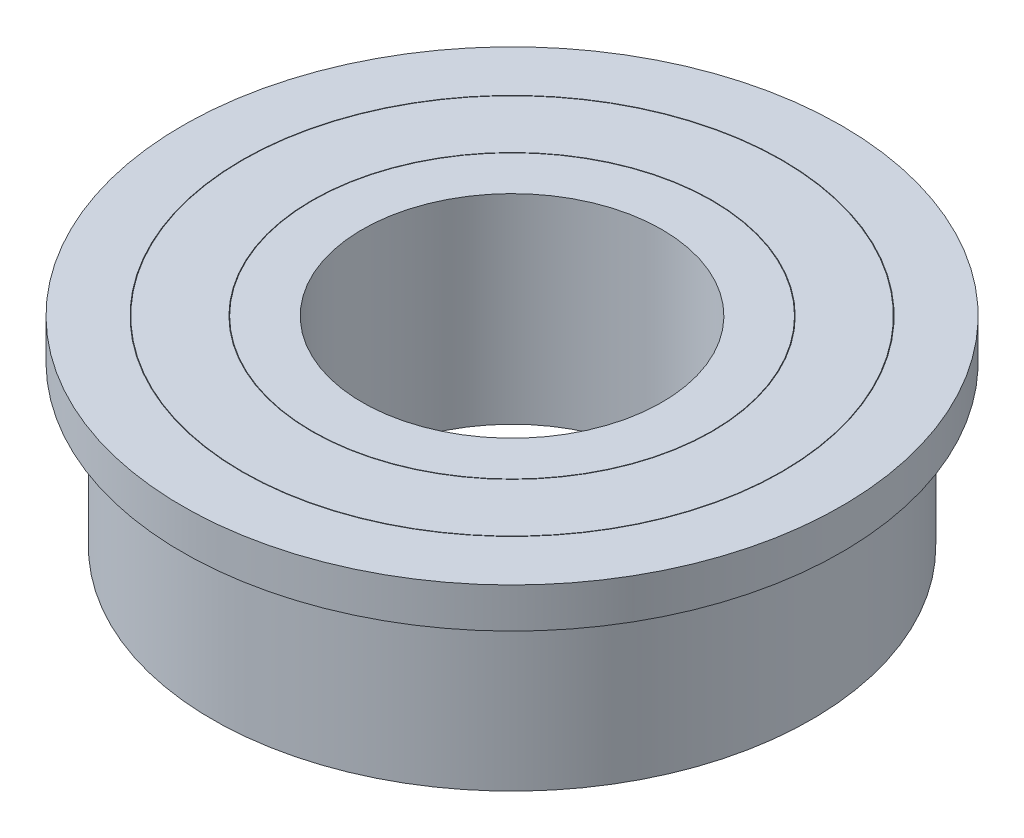
ISO-10303-21;
HEADER;
FILE_DESCRIPTION(('STEP AP214'),'2;1');
FILE_NAME('part.step','',(''),(''),'','','');
FILE_SCHEMA(('AUTOMOTIVE_DESIGN { 1 0 10303 214 1 1 1 1 }'));
ENDSEC;
DATA;
#1=APPLICATION_CONTEXT('core data for automotive mechanical design processes');
#2=APPLICATION_PROTOCOL_DEFINITION('international standard','automotive_design',2000,#1);
#3=PRODUCT_CONTEXT('',#1,'mechanical');
#4=PRODUCT('Part','Part','',(#3));
#5=PRODUCT_RELATED_PRODUCT_CATEGORY('part','',(#4));
#6=PRODUCT_DEFINITION_FORMATION('','',#4);
#7=PRODUCT_DEFINITION_CONTEXT('part definition',#1,'design');
#8=PRODUCT_DEFINITION('design','',#6,#7);
#9=PRODUCT_DEFINITION_SHAPE('','',#8);
#10=(LENGTH_UNIT() NAMED_UNIT(*) SI_UNIT(.MILLI.,.METRE.));
#11=(NAMED_UNIT(*) PLANE_ANGLE_UNIT() SI_UNIT($,.RADIAN.));
#12=(NAMED_UNIT(*) SI_UNIT($,.STERADIAN.) SOLID_ANGLE_UNIT());
#13=UNCERTAINTY_MEASURE_WITH_UNIT(LENGTH_MEASURE(1.E-05),#10,'distance_accuracy_value','');
#14=(GEOMETRIC_REPRESENTATION_CONTEXT(3) GLOBAL_UNCERTAINTY_ASSIGNED_CONTEXT((#13)) GLOBAL_UNIT_ASSIGNED_CONTEXT((#10,
#11,#12)) REPRESENTATION_CONTEXT('',''));
#15=CARTESIAN_POINT('',(0.,0.,0.));
#16=DIRECTION('',(0.,0.,1.));
#17=DIRECTION('',(1.,0.,0.));
#18=AXIS2_PLACEMENT_3D('',#15,#16,#17);
#19=CARTESIAN_POINT('',(0.,0.,4.01));
#20=DIRECTION('',(0.,1.,0.));
#21=DIRECTION('',(0.,0.,1.));
#22=AXIS2_PLACEMENT_3D('',#19,#20,#21);
#23=PLANE('',#22);
#24=CARTESIAN_POINT('',(0.,0.,0.));
#25=DIRECTION('',(0.,-1.,0.));
#26=DIRECTION('',(0.,0.,-1.));
#27=AXIS2_PLACEMENT_3D('',#24,#25,#26);
#28=CIRCLE('',#27,4.01);
#29=CARTESIAN_POINT('',(0.,0.,-4.01));
#30=VERTEX_POINT('',#29);
#31=EDGE_CURVE('E63',#30,#30,#28,.T.);
#32=ORIENTED_EDGE('',*,*,#31,.F.);
#33=EDGE_LOOP('',(#32));
#34=FACE_BOUND('',#33,.T.);
#35=CARTESIAN_POINT('',(0.,0.,0.));
#36=DIRECTION('',(0.,-1.,0.));
#37=DIRECTION('',(0.,0.,-1.));
#38=AXIS2_PLACEMENT_3D('',#35,#36,#37);
#39=CIRCLE('',#38,5.4);
#40=CARTESIAN_POINT('',(0.,0.,-5.4));
#41=VERTEX_POINT('',#40);
#42=EDGE_CURVE('E11',#41,#41,#39,.T.);
#43=ORIENTED_EDGE('',*,*,#42,.T.);
#44=EDGE_LOOP('',(#43));
#45=FACE_BOUND('',#44,.T.);
#46=ADVANCED_FACE('F46',(#34,#45),#23,.F.);
#47=CARTESIAN_POINT('',(0.,0.,0.));
#48=DIRECTION('',(0.,-1.,0.));
#49=DIRECTION('',(0.,0.,-1.));
#50=AXIS2_PLACEMENT_3D('',#47,#48,#49);
#51=CYLINDRICAL_SURFACE('',#50,5.4);
#52=ORIENTED_EDGE('',*,*,#42,.F.);
#53=EDGE_LOOP('',(#52));
#54=FACE_BOUND('',#53,.T.);
#55=CARTESIAN_POINT('',(0.,4.,0.));
#56=DIRECTION('',(0.,-1.,0.));
#57=DIRECTION('',(0.,0.,-1.));
#58=AXIS2_PLACEMENT_3D('',#55,#56,#57);
#59=CIRCLE('',#58,5.4);
#60=CARTESIAN_POINT('',(0.,4.,-5.4));
#61=VERTEX_POINT('',#60);
#62=EDGE_CURVE('E53',#61,#61,#59,.T.);
#63=ORIENTED_EDGE('',*,*,#62,.T.);
#64=EDGE_LOOP('',(#63));
#65=FACE_BOUND('',#64,.T.);
#66=ADVANCED_FACE('F73',(#54,#65),#51,.T.);
#67=CARTESIAN_POINT('',(0.,4.,5.4));
#68=DIRECTION('',(0.,-1.,0.));
#69=DIRECTION('',(0.,0.,-1.));
#70=AXIS2_PLACEMENT_3D('',#67,#68,#69);
#71=PLANE('',#70);
#72=ORIENTED_EDGE('',*,*,#62,.F.);
#73=EDGE_LOOP('',(#72));
#74=FACE_BOUND('',#73,.T.);
#75=CARTESIAN_POINT('',(0.,4.,0.));
#76=DIRECTION('',(0.,-1.,0.));
#77=DIRECTION('',(0.,0.,-1.));
#78=AXIS2_PLACEMENT_3D('',#75,#76,#77);
#79=CIRCLE('',#78,4.01);
#80=CARTESIAN_POINT('',(0.,4.,-4.01));
#81=VERTEX_POINT('',#80);
#82=EDGE_CURVE('E58',#81,#81,#79,.T.);
#83=ORIENTED_EDGE('',*,*,#82,.T.);
#84=EDGE_LOOP('',(#83));
#85=FACE_BOUND('',#84,.T.);
#86=ADVANCED_FACE('F77',(#74,#85),#71,.F.);
#87=CARTESIAN_POINT('',(0.,0.,0.));
#88=DIRECTION('',(0.,-1.,0.));
#89=DIRECTION('',(0.,0.,-1.));
#90=AXIS2_PLACEMENT_3D('',#87,#88,#89);
#91=CYLINDRICAL_SURFACE('',#90,4.01);
#92=ORIENTED_EDGE('',*,*,#82,.F.);
#93=EDGE_LOOP('',(#92));
#94=FACE_BOUND('',#93,.T.);
#95=ORIENTED_EDGE('',*,*,#31,.T.);
#96=EDGE_LOOP('',(#95));
#97=FACE_BOUND('',#96,.T.);
#98=ADVANCED_FACE('F70',(#94,#97),#91,.F.);
#99=CLOSED_SHELL('',(#46,#66,#86,#98));
#100=MANIFOLD_SOLID_BREP('B2',#99);
#101=CARTESIAN_POINT('',(0.,0.,5.41));
#102=DIRECTION('',(0.,1.,0.));
#103=DIRECTION('',(0.,0.,1.));
#104=AXIS2_PLACEMENT_3D('',#101,#102,#103);
#105=PLANE('',#104);
#106=CARTESIAN_POINT('',(0.,0.,0.));
#107=DIRECTION('',(0.,-1.,0.));
#108=DIRECTION('',(0.,0.,-1.));
#109=AXIS2_PLACEMENT_3D('',#106,#107,#108);
#110=CIRCLE('',#109,5.41);
#111=CARTESIAN_POINT('',(0.,0.,-5.41));
#112=VERTEX_POINT('',#111);
#113=EDGE_CURVE('E141',#112,#112,#110,.T.);
#114=ORIENTED_EDGE('',*,*,#113,.F.);
#115=EDGE_LOOP('',(#114));
#116=FACE_BOUND('',#115,.T.);
#117=CARTESIAN_POINT('',(0.,0.,0.));
#118=DIRECTION('',(0.,-1.,0.));
#119=DIRECTION('',(0.,0.,-1.));
#120=AXIS2_PLACEMENT_3D('',#117,#118,#119);
#121=CIRCLE('',#120,6.);
#122=CARTESIAN_POINT('',(0.,0.,-6.));
#123=VERTEX_POINT('',#122);
#124=EDGE_CURVE('E45',#123,#123,#121,.T.);
#125=ORIENTED_EDGE('',*,*,#124,.T.);
#126=EDGE_LOOP('',(#125));
#127=FACE_BOUND('',#126,.T.);
#128=ADVANCED_FACE('F119',(#116,#127),#105,.F.);
#129=CARTESIAN_POINT('',(0.,0.,0.));
#130=DIRECTION('',(0.,-1.,0.));
#131=DIRECTION('',(0.,0.,-1.));
#132=AXIS2_PLACEMENT_3D('',#129,#130,#131);
#133=CYLINDRICAL_SURFACE('',#132,6.);
#134=ORIENTED_EDGE('',*,*,#124,.F.);
#135=EDGE_LOOP('',(#134));
#136=FACE_BOUND('',#135,.T.);
#137=CARTESIAN_POINT('',(0.,3.2,0.));
#138=DIRECTION('',(0.,-1.,0.));
#139=DIRECTION('',(0.,0.,-1.));
#140=AXIS2_PLACEMENT_3D('',#137,#138,#139);
#141=CIRCLE('',#140,6.);
#142=CARTESIAN_POINT('',(0.,3.2,-6.));
#143=VERTEX_POINT('',#142);
#144=EDGE_CURVE('E125',#143,#143,#141,.T.);
#145=ORIENTED_EDGE('',*,*,#144,.T.);
#146=EDGE_LOOP('',(#145));
#147=FACE_BOUND('',#146,.T.);
#148=ADVANCED_FACE('F148',(#136,#147),#133,.T.);
#149=CARTESIAN_POINT('',(0.,3.2,6.));
#150=DIRECTION('',(0.,1.,0.));
#151=DIRECTION('',(0.,0.,1.));
#152=AXIS2_PLACEMENT_3D('',#149,#150,#151);
#153=PLANE('',#152);
#154=ORIENTED_EDGE('',*,*,#144,.F.);
#155=EDGE_LOOP('',(#154));
#156=FACE_BOUND('',#155,.T.);
#157=CARTESIAN_POINT('',(0.,3.2,0.));
#158=DIRECTION('',(0.,-1.,0.));
#159=DIRECTION('',(0.,0.,-1.));
#160=AXIS2_PLACEMENT_3D('',#157,#158,#159);
#161=CIRCLE('',#160,6.6);
#162=CARTESIAN_POINT('',(0.,3.2,-6.6));
#163=VERTEX_POINT('',#162);
#164=EDGE_CURVE('E129',#163,#163,#161,.T.);
#165=ORIENTED_EDGE('',*,*,#164,.T.);
#166=EDGE_LOOP('',(#165));
#167=FACE_BOUND('',#166,.T.);
#168=ADVANCED_FACE('F152',(#156,#167),#153,.F.);
#169=CARTESIAN_POINT('',(0.,0.,0.));
#170=DIRECTION('',(0.,-1.,0.));
#171=DIRECTION('',(0.,0.,-1.));
#172=AXIS2_PLACEMENT_3D('',#169,#170,#171);
#173=CYLINDRICAL_SURFACE('',#172,6.6);
#174=ORIENTED_EDGE('',*,*,#164,.F.);
#175=EDGE_LOOP('',(#174));
#176=FACE_BOUND('',#175,.T.);
#177=CARTESIAN_POINT('',(0.,4.,0.));
#178=DIRECTION('',(0.,-1.,0.));
#179=DIRECTION('',(0.,0.,-1.));
#180=AXIS2_PLACEMENT_3D('',#177,#178,#179);
#181=CIRCLE('',#180,6.6);
#182=CARTESIAN_POINT('',(0.,4.,-6.6));
#183=VERTEX_POINT('',#182);
#184=EDGE_CURVE('E133',#183,#183,#181,.T.);
#185=ORIENTED_EDGE('',*,*,#184,.T.);
#186=EDGE_LOOP('',(#185));
#187=FACE_BOUND('',#186,.T.);
#188=ADVANCED_FACE('F157',(#176,#187),#173,.T.);
#189=CARTESIAN_POINT('',(0.,4.,6.6));
#190=DIRECTION('',(0.,-1.,0.));
#191=DIRECTION('',(0.,0.,-1.));
#192=AXIS2_PLACEMENT_3D('',#189,#190,#191);
#193=PLANE('',#192);
#194=ORIENTED_EDGE('',*,*,#184,.F.);
#195=EDGE_LOOP('',(#194));
#196=FACE_BOUND('',#195,.T.);
#197=CARTESIAN_POINT('',(0.,4.,0.));
#198=DIRECTION('',(0.,-1.,0.));
#199=DIRECTION('',(0.,0.,-1.));
#200=AXIS2_PLACEMENT_3D('',#197,#198,#199);
#201=CIRCLE('',#200,5.41);
#202=CARTESIAN_POINT('',(0.,4.,-5.41));
#203=VERTEX_POINT('',#202);
#204=EDGE_CURVE('E138',#203,#203,#201,.T.);
#205=ORIENTED_EDGE('',*,*,#204,.T.);
#206=EDGE_LOOP('',(#205));
#207=FACE_BOUND('',#206,.T.);
#208=ADVANCED_FACE('F163',(#196,#207),#193,.F.);
#209=CARTESIAN_POINT('',(0.,0.,0.));
#210=DIRECTION('',(0.,-1.,0.));
#211=DIRECTION('',(0.,0.,-1.));
#212=AXIS2_PLACEMENT_3D('',#209,#210,#211);
#213=CYLINDRICAL_SURFACE('',#212,5.41);
#214=ORIENTED_EDGE('',*,*,#204,.F.);
#215=EDGE_LOOP('',(#214));
#216=FACE_BOUND('',#215,.T.);
#217=ORIENTED_EDGE('',*,*,#113,.T.);
#218=EDGE_LOOP('',(#217));
#219=FACE_BOUND('',#218,.T.);
#220=ADVANCED_FACE('F145',(#216,#219),#213,.F.);
#221=CLOSED_SHELL('',(#128,#148,#168,#188,#208,#220));
#222=MANIFOLD_SOLID_BREP('B6',#221);
#223=CARTESIAN_POINT('',(0.,0.,0.));
#224=DIRECTION('',(0.,-1.,0.));
#225=DIRECTION('',(0.,0.,-1.));
#226=AXIS2_PLACEMENT_3D('',#223,#224,#225);
#227=CYLINDRICAL_SURFACE('',#226,3.);
#228=CARTESIAN_POINT('',(0.,4.,0.));
#229=DIRECTION('',(0.,-1.,0.));
#230=DIRECTION('',(0.,0.,-1.));
#231=AXIS2_PLACEMENT_3D('',#228,#229,#230);
#232=CIRCLE('',#231,3.);
#233=CARTESIAN_POINT('',(0.,4.,-3.));
#234=VERTEX_POINT('',#233);
#235=EDGE_CURVE('E225',#234,#234,#232,.T.);
#236=ORIENTED_EDGE('',*,*,#235,.F.);
#237=EDGE_LOOP('',(#236));
#238=FACE_BOUND('',#237,.T.);
#239=CARTESIAN_POINT('',(0.,0.,0.));
#240=DIRECTION('',(0.,-1.,0.));
#241=DIRECTION('',(0.,0.,-1.));
#242=AXIS2_PLACEMENT_3D('',#239,#240,#241);
#243=CIRCLE('',#242,3.);
#244=CARTESIAN_POINT('',(0.,0.,-3.));
#245=VERTEX_POINT('',#244);
#246=EDGE_CURVE('E118',#245,#245,#243,.T.);
#247=ORIENTED_EDGE('',*,*,#246,.T.);
#248=EDGE_LOOP('',(#247));
#249=FACE_BOUND('',#248,.T.);
#250=ADVANCED_FACE('F211',(#238,#249),#227,.F.);
#251=CARTESIAN_POINT('',(0.,0.,3.));
#252=DIRECTION('',(0.,1.,0.));
#253=DIRECTION('',(0.,0.,1.));
#254=AXIS2_PLACEMENT_3D('',#251,#252,#253);
#255=PLANE('',#254);
#256=ORIENTED_EDGE('',*,*,#246,.F.);
#257=EDGE_LOOP('',(#256));
#258=FACE_BOUND('',#257,.T.);
#259=CARTESIAN_POINT('',(0.,0.,0.));
#260=DIRECTION('',(0.,-1.,0.));
#261=DIRECTION('',(0.,0.,-1.));
#262=AXIS2_PLACEMENT_3D('',#259,#260,#261);
#263=CIRCLE('',#262,4.);
#264=CARTESIAN_POINT('',(0.,0.,-4.));
#265=VERTEX_POINT('',#264);
#266=EDGE_CURVE('E217',#265,#265,#263,.T.);
#267=ORIENTED_EDGE('',*,*,#266,.T.);
#268=EDGE_LOOP('',(#267));
#269=FACE_BOUND('',#268,.T.);
#270=ADVANCED_FACE('F234',(#258,#269),#255,.F.);
#271=CARTESIAN_POINT('',(0.,0.,0.));
#272=DIRECTION('',(0.,-1.,0.));
#273=DIRECTION('',(0.,0.,-1.));
#274=AXIS2_PLACEMENT_3D('',#271,#272,#273);
#275=CYLINDRICAL_SURFACE('',#274,4.);
#276=ORIENTED_EDGE('',*,*,#266,.F.);
#277=EDGE_LOOP('',(#276));
#278=FACE_BOUND('',#277,.T.);
#279=CARTESIAN_POINT('',(0.,4.,0.));
#280=DIRECTION('',(0.,-1.,0.));
#281=DIRECTION('',(0.,0.,-1.));
#282=AXIS2_PLACEMENT_3D('',#279,#280,#281);
#283=CIRCLE('',#282,4.);
#284=CARTESIAN_POINT('',(0.,4.,-4.));
#285=VERTEX_POINT('',#284);
#286=EDGE_CURVE('E221',#285,#285,#283,.T.);
#287=ORIENTED_EDGE('',*,*,#286,.T.);
#288=EDGE_LOOP('',(#287));
#289=FACE_BOUND('',#288,.T.);
#290=ADVANCED_FACE('F238',(#278,#289),#275,.T.);
#291=CARTESIAN_POINT('',(0.,4.,4.));
#292=DIRECTION('',(0.,-1.,0.));
#293=DIRECTION('',(0.,0.,-1.));
#294=AXIS2_PLACEMENT_3D('',#291,#292,#293);
#295=PLANE('',#294);
#296=ORIENTED_EDGE('',*,*,#286,.F.);
#297=EDGE_LOOP('',(#296));
#298=FACE_BOUND('',#297,.T.);
#299=ORIENTED_EDGE('',*,*,#235,.T.);
#300=EDGE_LOOP('',(#299));
#301=FACE_BOUND('',#300,.T.);
#302=ADVANCED_FACE('F231',(#298,#301),#295,.F.);
#303=CLOSED_SHELL('',(#250,#270,#290,#302));
#304=MANIFOLD_SOLID_BREP('B40',#303);
#305=ADVANCED_BREP_SHAPE_REPRESENTATION('',(#18,#100,#222,#304),#14);
#306=SHAPE_DEFINITION_REPRESENTATION(#9,#305);
ENDSEC;
END-ISO-10303-21;
